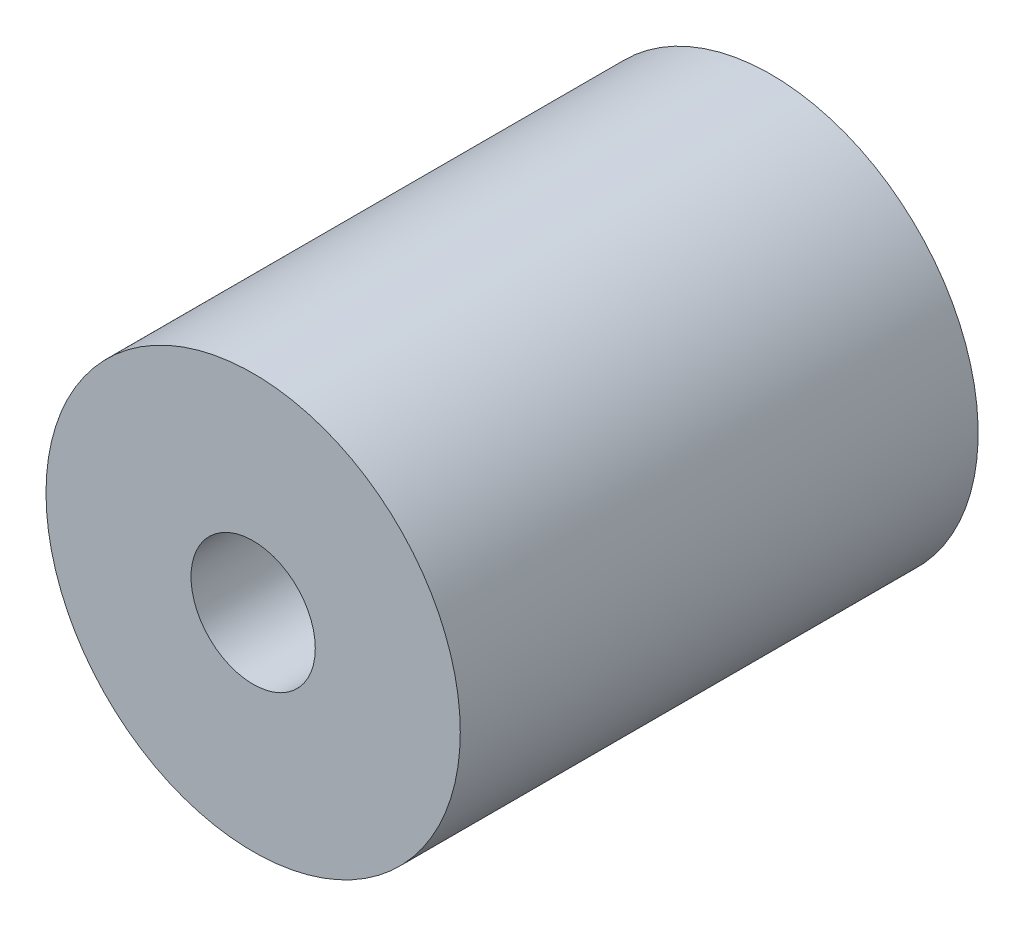
ISO-10303-21;
HEADER;
FILE_DESCRIPTION(('STEP AP214'),'2;1');
FILE_NAME('part.step','',(''),(''),'','','');
FILE_SCHEMA(('AUTOMOTIVE_DESIGN { 1 0 10303 214 1 1 1 1 }'));
ENDSEC;
DATA;
#1=APPLICATION_CONTEXT('core data for automotive mechanical design processes');
#2=APPLICATION_PROTOCOL_DEFINITION('international standard','automotive_design',2000,#1);
#3=PRODUCT_CONTEXT('',#1,'mechanical');
#4=PRODUCT('Part','Part','',(#3));
#5=PRODUCT_RELATED_PRODUCT_CATEGORY('part','',(#4));
#6=PRODUCT_DEFINITION_FORMATION('','',#4);
#7=PRODUCT_DEFINITION_CONTEXT('part definition',#1,'design');
#8=PRODUCT_DEFINITION('design','',#6,#7);
#9=PRODUCT_DEFINITION_SHAPE('','',#8);
#10=(LENGTH_UNIT() NAMED_UNIT(*) SI_UNIT(.MILLI.,.METRE.));
#11=(NAMED_UNIT(*) PLANE_ANGLE_UNIT() SI_UNIT($,.RADIAN.));
#12=(NAMED_UNIT(*) SI_UNIT($,.STERADIAN.) SOLID_ANGLE_UNIT());
#13=UNCERTAINTY_MEASURE_WITH_UNIT(LENGTH_MEASURE(1.E-05),#10,'distance_accuracy_value','');
#14=(GEOMETRIC_REPRESENTATION_CONTEXT(3) GLOBAL_UNCERTAINTY_ASSIGNED_CONTEXT((#13)) GLOBAL_UNIT_ASSIGNED_CONTEXT((#10,
#11,#12)) REPRESENTATION_CONTEXT('',''));
#15=CARTESIAN_POINT('',(0.,0.,0.));
#16=DIRECTION('',(0.,0.,1.));
#17=DIRECTION('',(1.,0.,0.));
#18=AXIS2_PLACEMENT_3D('',#15,#16,#17);
#19=CARTESIAN_POINT('',(0.,0.,10.));
#20=DIRECTION('',(0.,0.,1.));
#21=DIRECTION('',(1.,0.,0.));
#22=AXIS2_PLACEMENT_3D('',#19,#20,#21);
#23=PLANE('',#22);
#24=CARTESIAN_POINT('',(0.,0.,10.));
#25=DIRECTION('',(0.,0.,1.));
#26=DIRECTION('',(1.,0.,0.));
#27=AXIS2_PLACEMENT_3D('',#24,#25,#26);
#28=CIRCLE('',#27,10.);
#29=CARTESIAN_POINT('',(10.,0.,10.));
#30=VERTEX_POINT('',#29);
#31=EDGE_CURVE('E44',#30,#30,#28,.T.);
#32=ORIENTED_EDGE('',*,*,#31,.T.);
#33=EDGE_LOOP('',(#32));
#34=FACE_BOUND('',#33,.T.);
#35=CARTESIAN_POINT('',(0.,0.,10.));
#36=DIRECTION('',(0.,0.,1.));
#37=DIRECTION('',(1.,0.,0.));
#38=AXIS2_PLACEMENT_3D('',#35,#36,#37);
#39=CIRCLE('',#38,3.);
#40=CARTESIAN_POINT('',(3.,0.,10.));
#41=VERTEX_POINT('',#40);
#42=EDGE_CURVE('E48',#41,#41,#39,.T.);
#43=ORIENTED_EDGE('',*,*,#42,.F.);
#44=EDGE_LOOP('',(#43));
#45=FACE_BOUND('',#44,.T.);
#46=ADVANCED_FACE('F37',(#34,#45),#23,.T.);
#47=CARTESIAN_POINT('',(0.,0.,10.));
#48=DIRECTION('',(0.,0.,-1.));
#49=DIRECTION('',(-1.,0.,0.));
#50=AXIS2_PLACEMENT_3D('',#47,#48,#49);
#51=CYLINDRICAL_SURFACE('',#50,10.);
#52=ORIENTED_EDGE('',*,*,#31,.F.);
#53=EDGE_LOOP('',(#52));
#54=FACE_BOUND('',#53,.T.);
#55=CARTESIAN_POINT('',(0.,0.,-15.));
#56=DIRECTION('',(0.,0.,-1.));
#57=DIRECTION('',(-1.,0.,0.));
#58=AXIS2_PLACEMENT_3D('',#55,#56,#57);
#59=CIRCLE('',#58,10.);
#60=CARTESIAN_POINT('',(-10.,0.,-15.));
#61=VERTEX_POINT('',#60);
#62=EDGE_CURVE('E56',#61,#61,#59,.T.);
#63=ORIENTED_EDGE('',*,*,#62,.F.);
#64=EDGE_LOOP('',(#63));
#65=FACE_BOUND('',#64,.T.);
#66=ADVANCED_FACE('F39',(#54,#65),#51,.T.);
#67=CARTESIAN_POINT('',(0.,0.,10.));
#68=DIRECTION('',(0.,0.,-1.));
#69=DIRECTION('',(-1.,0.,0.));
#70=AXIS2_PLACEMENT_3D('',#67,#68,#69);
#71=CYLINDRICAL_SURFACE('',#70,3.);
#72=ORIENTED_EDGE('',*,*,#42,.T.);
#73=EDGE_LOOP('',(#72));
#74=FACE_BOUND('',#73,.T.);
#75=CARTESIAN_POINT('',(0.,0.,0.));
#76=DIRECTION('',(0.,0.,1.));
#77=DIRECTION('',(1.,0.,0.));
#78=AXIS2_PLACEMENT_3D('',#75,#76,#77);
#79=CIRCLE('',#78,3.);
#80=CARTESIAN_POINT('',(3.,0.,0.));
#81=VERTEX_POINT('',#80);
#82=EDGE_CURVE('E52',#81,#81,#79,.T.);
#83=ORIENTED_EDGE('',*,*,#82,.F.);
#84=EDGE_LOOP('',(#83));
#85=FACE_BOUND('',#84,.T.);
#86=ADVANCED_FACE('F77',(#74,#85),#71,.F.);
#87=CARTESIAN_POINT('',(0.,0.,0.));
#88=DIRECTION('',(0.,0.,-1.));
#89=DIRECTION('',(-1.,0.,0.));
#90=AXIS2_PLACEMENT_3D('',#87,#88,#89);
#91=PLANE('',#90);
#92=ORIENTED_EDGE('',*,*,#82,.T.);
#93=EDGE_LOOP('',(#92));
#94=FACE_BOUND('',#93,.T.);
#95=ADVANCED_FACE('F68',(#94),#91,.F.);
#96=CARTESIAN_POINT('',(0.,0.,-15.));
#97=DIRECTION('',(0.,0.,-1.));
#98=DIRECTION('',(-1.,0.,0.));
#99=AXIS2_PLACEMENT_3D('',#96,#97,#98);
#100=PLANE('',#99);
#101=ORIENTED_EDGE('',*,*,#62,.T.);
#102=EDGE_LOOP('',(#101));
#103=FACE_BOUND('',#102,.T.);
#104=CARTESIAN_POINT('',(0.,0.,-15.));
#105=DIRECTION('',(0.,0.,-1.));
#106=DIRECTION('',(-1.,0.,0.));
#107=AXIS2_PLACEMENT_3D('',#104,#105,#106);
#108=CIRCLE('',#107,3.);
#109=CARTESIAN_POINT('',(-3.,0.,-15.));
#110=VERTEX_POINT('',#109);
#111=EDGE_CURVE('E60',#110,#110,#108,.T.);
#112=ORIENTED_EDGE('',*,*,#111,.F.);
#113=EDGE_LOOP('',(#112));
#114=FACE_BOUND('',#113,.T.);
#115=ADVANCED_FACE('F66',(#103,#114),#100,.T.);
#116=CARTESIAN_POINT('',(0.,0.,-15.));
#117=DIRECTION('',(0.,0.,1.));
#118=DIRECTION('',(1.,0.,0.));
#119=AXIS2_PLACEMENT_3D('',#116,#117,#118);
#120=CYLINDRICAL_SURFACE('',#119,3.);
#121=ORIENTED_EDGE('',*,*,#111,.T.);
#122=EDGE_LOOP('',(#121));
#123=FACE_BOUND('',#122,.T.);
#124=CARTESIAN_POINT('',(0.,0.,-5.));
#125=DIRECTION('',(0.,0.,-1.));
#126=DIRECTION('',(-1.,0.,0.));
#127=AXIS2_PLACEMENT_3D('',#124,#125,#126);
#128=CIRCLE('',#127,3.);
#129=CARTESIAN_POINT('',(-3.,0.,-5.));
#130=VERTEX_POINT('',#129);
#131=EDGE_CURVE('E10',#130,#130,#128,.F.);
#132=ORIENTED_EDGE('',*,*,#131,.T.);
#133=EDGE_LOOP('',(#132));
#134=FACE_BOUND('',#133,.T.);
#135=ADVANCED_FACE('F64',(#123,#134),#120,.F.);
#136=CARTESIAN_POINT('',(0.,0.,-5.));
#137=DIRECTION('',(0.,0.,-1.));
#138=DIRECTION('',(-1.,0.,0.));
#139=AXIS2_PLACEMENT_3D('',#136,#137,#138);
#140=PLANE('',#139);
#141=ORIENTED_EDGE('',*,*,#131,.F.);
#142=EDGE_LOOP('',(#141));
#143=FACE_BOUND('',#142,.T.);
#144=ADVANCED_FACE('F75',(#143),#140,.T.);
#145=CLOSED_SHELL('',(#46,#66,#86,#95,#115,#135,#144));
#146=MANIFOLD_SOLID_BREP('B2',#145);
#147=ADVANCED_BREP_SHAPE_REPRESENTATION('',(#18,#146),#14);
#148=SHAPE_DEFINITION_REPRESENTATION(#9,#147);
ENDSEC;
END-ISO-10303-21;
